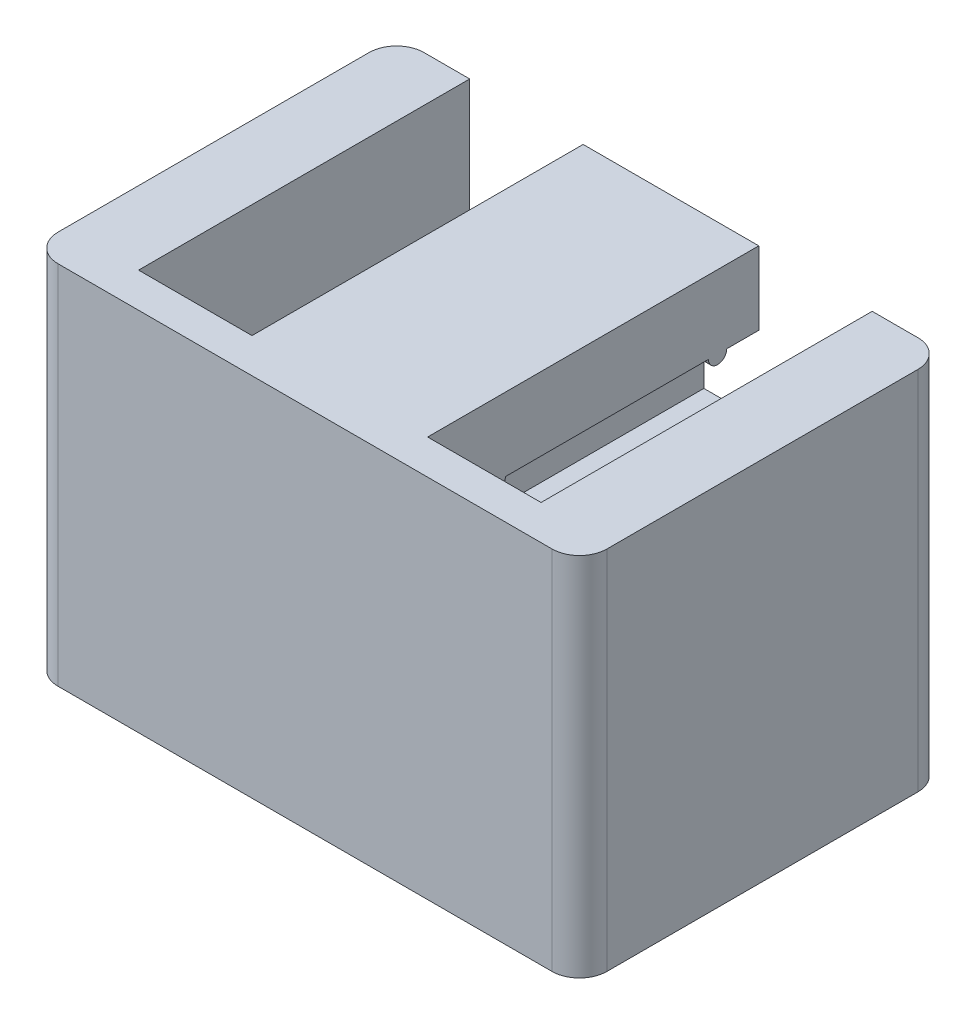
ISO-10303-21;
HEADER;
FILE_DESCRIPTION(('STEP AP214'),'2;1');
FILE_NAME('part.step','',(''),(''),'','','');
FILE_SCHEMA(('AUTOMOTIVE_DESIGN { 1 0 10303 214 1 1 1 1 }'));
ENDSEC;
DATA;
#1=APPLICATION_CONTEXT('core data for automotive mechanical design processes');
#2=APPLICATION_PROTOCOL_DEFINITION('international standard','automotive_design',2000,#1);
#3=PRODUCT_CONTEXT('',#1,'mechanical');
#4=PRODUCT('Part','Part','',(#3));
#5=PRODUCT_RELATED_PRODUCT_CATEGORY('part','',(#4));
#6=PRODUCT_DEFINITION_FORMATION('','',#4);
#7=PRODUCT_DEFINITION_CONTEXT('part definition',#1,'design');
#8=PRODUCT_DEFINITION('design','',#6,#7);
#9=PRODUCT_DEFINITION_SHAPE('','',#8);
#10=(LENGTH_UNIT() NAMED_UNIT(*) SI_UNIT(.MILLI.,.METRE.));
#11=(NAMED_UNIT(*) PLANE_ANGLE_UNIT() SI_UNIT($,.RADIAN.));
#12=(NAMED_UNIT(*) SI_UNIT($,.STERADIAN.) SOLID_ANGLE_UNIT());
#13=UNCERTAINTY_MEASURE_WITH_UNIT(LENGTH_MEASURE(1.E-05),#10,'distance_accuracy_value','');
#14=(GEOMETRIC_REPRESENTATION_CONTEXT(3) GLOBAL_UNCERTAINTY_ASSIGNED_CONTEXT((#13)) GLOBAL_UNIT_ASSIGNED_CONTEXT((#10,
#11,#12)) REPRESENTATION_CONTEXT('',''));
#15=CARTESIAN_POINT('',(0.,0.,0.));
#16=DIRECTION('',(0.,0.,1.));
#17=DIRECTION('',(1.,0.,0.));
#18=AXIS2_PLACEMENT_3D('',#15,#16,#17);
#19=CARTESIAN_POINT('',(1.8,-49.2873456126754,-1.9));
#20=DIRECTION('',(0.,1.,0.));
#21=DIRECTION('',(0.,0.,1.));
#22=AXIS2_PLACEMENT_3D('',#19,#20,#21);
#23=PLANE('',#22);
#24=DIRECTION('',(0.,0.,-1.));
#25=VECTOR('',#24,1.);
#26=CARTESIAN_POINT('',(1.8,-49.2873456126754,-1.9));
#27=LINE('',#26,#25);
#28=CARTESIAN_POINT('',(1.8,-49.2873456126754,-1.9));
#29=VERTEX_POINT('',#28);
#30=CARTESIAN_POINT('',(1.8,-49.2873456126754,-5.14999999999999));
#31=VERTEX_POINT('',#30);
#32=EDGE_CURVE('E247',#29,#31,#27,.T.);
#33=ORIENTED_EDGE('',*,*,#32,.T.);
#34=DIRECTION('',(1.,0.,0.));
#35=VECTOR('',#34,1.);
#36=CARTESIAN_POINT('',(1.8,-49.2873456126754,-5.15));
#37=LINE('',#36,#35);
#38=CARTESIAN_POINT('',(4.8,-49.2873456126754,-5.14999999999999));
#39=VERTEX_POINT('',#38);
#40=EDGE_CURVE('E230',#31,#39,#37,.T.);
#41=ORIENTED_EDGE('',*,*,#40,.T.);
#42=DIRECTION('',(0.,0.,-1.));
#43=VECTOR('',#42,1.);
#44=CARTESIAN_POINT('',(4.8,-49.2873456126754,-1.9));
#45=LINE('',#44,#43);
#46=CARTESIAN_POINT('',(4.8,-49.2873456126754,-1.9));
#47=VERTEX_POINT('',#46);
#48=EDGE_CURVE('E254',#47,#39,#45,.T.);
#49=ORIENTED_EDGE('',*,*,#48,.F.);
#50=DIRECTION('',(1.,0.,0.));
#51=VECTOR('',#50,1.);
#52=CARTESIAN_POINT('',(1.8,-49.2873456126754,-1.9));
#53=LINE('',#52,#51);
#54=EDGE_CURVE('E453',#29,#47,#53,.T.);
#55=ORIENTED_EDGE('',*,*,#54,.F.);
#56=EDGE_LOOP('',(#33,#41,#49,#55));
#57=FACE_BOUND('',#56,.T.);
#58=ADVANCED_FACE('F38',(#57),#23,.F.);
#59=CARTESIAN_POINT('',(4.8,-49.2873456126754,-6.14999999999999));
#60=VERTEX_POINT('',#59);
#61=CARTESIAN_POINT('',(4.8,-49.2873456126754,-17.25));
#62=VERTEX_POINT('',#61);
#63=EDGE_CURVE('E240',#60,#62,#45,.T.);
#64=ORIENTED_EDGE('',*,*,#63,.F.);
#65=DIRECTION('',(1.,0.,0.));
#66=VECTOR('',#65,1.);
#67=CARTESIAN_POINT('',(1.8,-49.2873456126754,-6.15));
#68=LINE('',#67,#66);
#69=CARTESIAN_POINT('',(1.8,-49.2873456126754,-6.15));
#70=VERTEX_POINT('',#69);
#71=EDGE_CURVE('E227',#70,#60,#68,.T.);
#72=ORIENTED_EDGE('',*,*,#71,.F.);
#73=CARTESIAN_POINT('',(1.8,-49.2873456126754,-17.25));
#74=VERTEX_POINT('',#73);
#75=EDGE_CURVE('E238',#70,#74,#27,.T.);
#76=ORIENTED_EDGE('',*,*,#75,.T.);
#77=DIRECTION('',(1.,0.,0.));
#78=VECTOR('',#77,1.);
#79=CARTESIAN_POINT('',(1.8,-49.2873456126754,-17.25));
#80=LINE('',#79,#78);
#81=EDGE_CURVE('E774',#74,#62,#80,.T.);
#82=ORIENTED_EDGE('',*,*,#81,.T.);
#83=EDGE_LOOP('',(#64,#72,#76,#82));
#84=FACE_BOUND('',#83,.T.);
#85=ADVANCED_FACE('F236',(#84),#23,.F.);
#86=CARTESIAN_POINT('',(-1.8,-49.2873456126754,-1.9));
#87=DIRECTION('',(0.,1.,0.));
#88=DIRECTION('',(0.,0.,1.));
#89=AXIS2_PLACEMENT_3D('',#86,#87,#88);
#90=PLANE('',#89);
#91=DIRECTION('',(0.,0.,-1.));
#92=VECTOR('',#91,1.);
#93=CARTESIAN_POINT('',(-1.8,-49.2873456126754,-1.9));
#94=LINE('',#93,#92);
#95=CARTESIAN_POINT('',(-1.8,-49.2873456126754,-6.14999999999999));
#96=VERTEX_POINT('',#95);
#97=CARTESIAN_POINT('',(-1.8,-49.2873456126754,-17.25));
#98=VERTEX_POINT('',#97);
#99=EDGE_CURVE('E314',#96,#98,#94,.T.);
#100=ORIENTED_EDGE('',*,*,#99,.F.);
#101=DIRECTION('',(-1.,0.,0.));
#102=VECTOR('',#101,1.);
#103=CARTESIAN_POINT('',(-1.8,-49.2873456126754,-6.15));
#104=LINE('',#103,#102);
#105=CARTESIAN_POINT('',(-4.8,-49.2873456126754,-6.14999999999999));
#106=VERTEX_POINT('',#105);
#107=EDGE_CURVE('E432',#96,#106,#104,.T.);
#108=ORIENTED_EDGE('',*,*,#107,.T.);
#109=DIRECTION('',(0.,0.,-1.));
#110=VECTOR('',#109,1.);
#111=CARTESIAN_POINT('',(-4.8,-49.2873456126754,-1.9));
#112=LINE('',#111,#110);
#113=CARTESIAN_POINT('',(-4.8,-49.2873456126754,-17.25));
#114=VERTEX_POINT('',#113);
#115=EDGE_CURVE('E300',#106,#114,#112,.T.);
#116=ORIENTED_EDGE('',*,*,#115,.T.);
#117=DIRECTION('',(-1.,0.,0.));
#118=VECTOR('',#117,1.);
#119=CARTESIAN_POINT('',(-1.8,-49.2873456126754,-17.25));
#120=LINE('',#119,#118);
#121=EDGE_CURVE('E286',#98,#114,#120,.T.);
#122=ORIENTED_EDGE('',*,*,#121,.F.);
#123=EDGE_LOOP('',(#100,#108,#116,#122));
#124=FACE_BOUND('',#123,.T.);
#125=ADVANCED_FACE('F430',(#124),#90,.F.);
#126=CARTESIAN_POINT('',(-1.8,-49.2873456126754,-18.25));
#127=VERTEX_POINT('',#126);
#128=CARTESIAN_POINT('',(-1.8,-49.2873456126754,-20.));
#129=VERTEX_POINT('',#128);
#130=EDGE_CURVE('E281',#127,#129,#94,.T.);
#131=ORIENTED_EDGE('',*,*,#130,.F.);
#132=DIRECTION('',(-1.,0.,0.));
#133=VECTOR('',#132,1.);
#134=CARTESIAN_POINT('',(-1.8,-49.2873456126754,-18.25));
#135=LINE('',#134,#133);
#136=CARTESIAN_POINT('',(-4.8,-49.2873456126754,-18.25));
#137=VERTEX_POINT('',#136);
#138=EDGE_CURVE('E424',#127,#137,#135,.T.);
#139=ORIENTED_EDGE('',*,*,#138,.T.);
#140=CARTESIAN_POINT('',(-4.8,-49.2873456126754,-20.));
#141=VERTEX_POINT('',#140);
#142=EDGE_CURVE('E301',#137,#141,#112,.T.);
#143=ORIENTED_EDGE('',*,*,#142,.T.);
#144=DIRECTION('',(1.,0.,0.));
#145=VECTOR('',#144,1.);
#146=CARTESIAN_POINT('',(-1.8,-49.2873456126754,-20.));
#147=LINE('',#146,#145);
#148=EDGE_CURVE('E282',#141,#129,#147,.T.);
#149=ORIENTED_EDGE('',*,*,#148,.T.);
#150=EDGE_LOOP('',(#131,#139,#143,#149));
#151=FACE_BOUND('',#150,.T.);
#152=ADVANCED_FACE('F423',(#151),#90,.F.);
#153=CARTESIAN_POINT('',(-15.,-45.2873456126754,-20.));
#154=DIRECTION('',(-1.,0.,0.));
#155=DIRECTION('',(0.,-1.,0.));
#156=AXIS2_PLACEMENT_3D('',#153,#154,#155);
#157=PLANE('',#156);
#158=DIRECTION('',(0.,0.,1.));
#159=VECTOR('',#158,1.);
#160=CARTESIAN_POINT('',(-15.,-65.2873456126754,-20.));
#161=LINE('',#160,#159);
#162=CARTESIAN_POINT('',(-15.,-65.2873456126754,-18.5));
#163=VERTEX_POINT('',#162);
#164=CARTESIAN_POINT('',(-15.,-65.2873456126754,-1.5));
#165=VERTEX_POINT('',#164);
#166=EDGE_CURVE('E322',#163,#165,#161,.T.);
#167=ORIENTED_EDGE('',*,*,#166,.T.);
#168=DIRECTION('',(0.,-1.,0.));
#169=VECTOR('',#168,1.);
#170=CARTESIAN_POINT('',(-15.,-45.2873456126754,-1.5));
#171=LINE('',#170,#169);
#172=CARTESIAN_POINT('',(-15.,-45.2873456126754,-1.5));
#173=VERTEX_POINT('',#172);
#174=EDGE_CURVE('E12',#165,#173,#171,.F.);
#175=ORIENTED_EDGE('',*,*,#174,.T.);
#176=DIRECTION('',(0.,0.,1.));
#177=VECTOR('',#176,1.);
#178=CARTESIAN_POINT('',(-15.,-45.2873456126754,-20.));
#179=LINE('',#178,#177);
#180=CARTESIAN_POINT('',(-15.,-45.2873456126754,-18.5));
#181=VERTEX_POINT('',#180);
#182=EDGE_CURVE('E330',#181,#173,#179,.T.);
#183=ORIENTED_EDGE('',*,*,#182,.F.);
#184=DIRECTION('',(0.,-1.,0.));
#185=VECTOR('',#184,1.);
#186=CARTESIAN_POINT('',(-15.,-65.2873456126754,-18.5));
#187=LINE('',#186,#185);
#188=EDGE_CURVE('E46',#181,#163,#187,.T.);
#189=ORIENTED_EDGE('',*,*,#188,.T.);
#190=EDGE_LOOP('',(#167,#175,#183,#189));
#191=FACE_BOUND('',#190,.T.);
#192=ADVANCED_FACE('F370',(#191),#157,.T.);
#193=CARTESIAN_POINT('',(-15.,-45.2873456126754,-20.));
#194=DIRECTION('',(0.,1.,0.));
#195=DIRECTION('',(0.,0.,1.));
#196=AXIS2_PLACEMENT_3D('',#193,#194,#195);
#197=PLANE('',#196);
#198=DIRECTION('',(0.,0.,1.));
#199=VECTOR('',#198,1.);
#200=CARTESIAN_POINT('',(15.,-45.2873456126754,-20.));
#201=LINE('',#200,#199);
#202=CARTESIAN_POINT('',(15.,-45.2873456126754,-18.5));
#203=VERTEX_POINT('',#202);
#204=CARTESIAN_POINT('',(15.,-45.2873456126754,-1.5));
#205=VERTEX_POINT('',#204);
#206=EDGE_CURVE('E334',#203,#205,#201,.T.);
#207=ORIENTED_EDGE('',*,*,#206,.F.);
#208=CARTESIAN_POINT('',(13.5,-45.2873456126754,-18.5));
#209=DIRECTION('',(0.,1.,0.));
#210=DIRECTION('',(0.,0.,1.));
#211=AXIS2_PLACEMENT_3D('',#208,#209,#210);
#212=CIRCLE('',#211,1.5);
#213=CARTESIAN_POINT('',(13.5,-45.2873456126754,-20.));
#214=VERTEX_POINT('',#213);
#215=EDGE_CURVE('E351',#203,#214,#212,.T.);
#216=ORIENTED_EDGE('',*,*,#215,.T.);
#217=DIRECTION('',(-1.,0.,0.));
#218=VECTOR('',#217,1.);
#219=CARTESIAN_POINT('',(-15.,-45.2873456126754,-20.));
#220=LINE('',#219,#218);
#221=CARTESIAN_POINT('',(11.,-45.2873456126754,-20.));
#222=VERTEX_POINT('',#221);
#223=EDGE_CURVE('E320',#214,#222,#220,.T.);
#224=ORIENTED_EDGE('',*,*,#223,.T.);
#225=DIRECTION('',(0.,0.,-1.));
#226=VECTOR('',#225,1.);
#227=CARTESIAN_POINT('',(11.,-45.2873456126754,-1.9));
#228=LINE('',#227,#226);
#229=CARTESIAN_POINT('',(11.,-45.2873456126754,-1.9));
#230=VERTEX_POINT('',#229);
#231=EDGE_CURVE('E259',#230,#222,#228,.T.);
#232=ORIENTED_EDGE('',*,*,#231,.F.);
#233=DIRECTION('',(1.,0.,0.));
#234=VECTOR('',#233,1.);
#235=CARTESIAN_POINT('',(4.8,-45.2873456126754,-1.9));
#236=LINE('',#235,#234);
#237=CARTESIAN_POINT('',(4.8,-45.2873456126754,-1.9));
#238=VERTEX_POINT('',#237);
#239=EDGE_CURVE('E441',#238,#230,#236,.T.);
#240=ORIENTED_EDGE('',*,*,#239,.F.);
#241=DIRECTION('',(0.,0.,-1.));
#242=VECTOR('',#241,1.);
#243=CARTESIAN_POINT('',(4.8,-45.2873456126754,-1.9));
#244=LINE('',#243,#242);
#245=CARTESIAN_POINT('',(4.8,-45.2873456126754,-20.));
#246=VERTEX_POINT('',#245);
#247=EDGE_CURVE('E327',#238,#246,#244,.T.);
#248=ORIENTED_EDGE('',*,*,#247,.T.);
#249=CARTESIAN_POINT('',(-4.8,-45.2873456126754,-20.));
#250=VERTEX_POINT('',#249);
#251=EDGE_CURVE('E323',#246,#250,#220,.T.);
#252=ORIENTED_EDGE('',*,*,#251,.T.);
#253=DIRECTION('',(0.,0.,-1.));
#254=VECTOR('',#253,1.);
#255=CARTESIAN_POINT('',(-4.8,-45.2873456126754,-1.9));
#256=LINE('',#255,#254);
#257=CARTESIAN_POINT('',(-4.8,-45.2873456126754,-1.9));
#258=VERTEX_POINT('',#257);
#259=EDGE_CURVE('E302',#258,#250,#256,.T.);
#260=ORIENTED_EDGE('',*,*,#259,.F.);
#261=DIRECTION('',(1.,0.,0.));
#262=VECTOR('',#261,1.);
#263=CARTESIAN_POINT('',(-4.8,-45.2873456126754,-1.9));
#264=LINE('',#263,#262);
#265=CARTESIAN_POINT('',(-11.,-45.2873456126754,-1.9));
#266=VERTEX_POINT('',#265);
#267=EDGE_CURVE('E276',#266,#258,#264,.T.);
#268=ORIENTED_EDGE('',*,*,#267,.F.);
#269=DIRECTION('',(0.,0.,-1.));
#270=VECTOR('',#269,1.);
#271=CARTESIAN_POINT('',(-11.,-45.2873456126754,-1.9));
#272=LINE('',#271,#270);
#273=CARTESIAN_POINT('',(-11.,-45.2873456126754,-20.));
#274=VERTEX_POINT('',#273);
#275=EDGE_CURVE('E304',#266,#274,#272,.T.);
#276=ORIENTED_EDGE('',*,*,#275,.T.);
#277=CARTESIAN_POINT('',(-13.5,-45.2873456126754,-20.));
#278=VERTEX_POINT('',#277);
#279=EDGE_CURVE('E318',#274,#278,#220,.T.);
#280=ORIENTED_EDGE('',*,*,#279,.T.);
#281=CARTESIAN_POINT('',(-13.5,-45.2873456126754,-18.5));
#282=DIRECTION('',(0.,1.,0.));
#283=DIRECTION('',(0.,0.,1.));
#284=AXIS2_PLACEMENT_3D('',#281,#282,#283);
#285=CIRCLE('',#284,1.5);
#286=EDGE_CURVE('E345',#278,#181,#285,.T.);
#287=ORIENTED_EDGE('',*,*,#286,.T.);
#288=ORIENTED_EDGE('',*,*,#182,.T.);
#289=CARTESIAN_POINT('',(-13.5,-45.2873456126754,-1.5));
#290=DIRECTION('',(0.,1.,0.));
#291=DIRECTION('',(0.,0.,1.));
#292=AXIS2_PLACEMENT_3D('',#289,#290,#291);
#293=CIRCLE('',#292,1.5);
#294=CARTESIAN_POINT('',(-13.5,-45.2873456126754,0.));
#295=VERTEX_POINT('',#294);
#296=EDGE_CURVE('E347',#173,#295,#293,.T.);
#297=ORIENTED_EDGE('',*,*,#296,.T.);
#298=DIRECTION('',(-1.,0.,0.));
#299=VECTOR('',#298,1.);
#300=CARTESIAN_POINT('',(-15.,-45.2873456126754,0.));
#301=LINE('',#300,#299);
#302=CARTESIAN_POINT('',(13.5,-45.2873456126754,0.));
#303=VERTEX_POINT('',#302);
#304=EDGE_CURVE('E319',#303,#295,#301,.T.);
#305=ORIENTED_EDGE('',*,*,#304,.F.);
#306=CARTESIAN_POINT('',(13.5,-45.2873456126754,-1.5));
#307=DIRECTION('',(0.,1.,0.));
#308=DIRECTION('',(0.,0.,1.));
#309=AXIS2_PLACEMENT_3D('',#306,#307,#308);
#310=CIRCLE('',#309,1.5);
#311=EDGE_CURVE('E349',#303,#205,#310,.T.);
#312=ORIENTED_EDGE('',*,*,#311,.T.);
#313=EDGE_LOOP('',(#207,#216,#224,#232,#240,#248,#252,#260,#268,#276,#280,#287,#288,#297,#305,#312));
#314=FACE_BOUND('',#313,.T.);
#315=ADVANCED_FACE('F384',(#314),#197,.T.);
#316=CARTESIAN_POINT('',(15.,-45.2873456126754,-20.));
#317=DIRECTION('',(1.,0.,0.));
#318=DIRECTION('',(0.,0.,-1.));
#319=AXIS2_PLACEMENT_3D('',#316,#317,#318);
#320=PLANE('',#319);
#321=DIRECTION('',(0.,0.,1.));
#322=VECTOR('',#321,1.);
#323=CARTESIAN_POINT('',(15.,-65.2873456126754,-20.));
#324=LINE('',#323,#322);
#325=CARTESIAN_POINT('',(15.,-65.2873456126754,-18.5));
#326=VERTEX_POINT('',#325);
#327=CARTESIAN_POINT('',(15.,-65.2873456126754,-1.5));
#328=VERTEX_POINT('',#327);
#329=EDGE_CURVE('E337',#326,#328,#324,.T.);
#330=ORIENTED_EDGE('',*,*,#329,.F.);
#331=DIRECTION('',(0.,1.,0.));
#332=VECTOR('',#331,1.);
#333=CARTESIAN_POINT('',(15.,-45.2873456126754,-18.5));
#334=LINE('',#333,#332);
#335=EDGE_CURVE('E342',#326,#203,#334,.T.);
#336=ORIENTED_EDGE('',*,*,#335,.T.);
#337=ORIENTED_EDGE('',*,*,#206,.T.);
#338=DIRECTION('',(0.,1.,0.));
#339=VECTOR('',#338,1.);
#340=CARTESIAN_POINT('',(15.,-45.2873456126754,-1.5));
#341=LINE('',#340,#339);
#342=EDGE_CURVE('E333',#205,#328,#341,.F.);
#343=ORIENTED_EDGE('',*,*,#342,.T.);
#344=EDGE_LOOP('',(#330,#336,#337,#343));
#345=FACE_BOUND('',#344,.T.);
#346=ADVANCED_FACE('F496',(#345),#320,.T.);
#347=CARTESIAN_POINT('',(-15.,-65.2873456126754,-20.));
#348=DIRECTION('',(0.,-1.,0.));
#349=DIRECTION('',(0.,0.,-1.));
#350=AXIS2_PLACEMENT_3D('',#347,#348,#349);
#351=PLANE('',#350);
#352=DIRECTION('',(1.,0.,0.));
#353=VECTOR('',#352,1.);
#354=CARTESIAN_POINT('',(-15.,-65.2873456126754,-20.));
#355=LINE('',#354,#353);
#356=CARTESIAN_POINT('',(-13.5,-65.2873456126754,-20.));
#357=VERTEX_POINT('',#356);
#358=CARTESIAN_POINT('',(13.5,-65.2873456126754,-20.));
#359=VERTEX_POINT('',#358);
#360=EDGE_CURVE('E315',#357,#359,#355,.T.);
#361=ORIENTED_EDGE('',*,*,#360,.T.);
#362=CARTESIAN_POINT('',(13.5,-65.2873456126754,-18.5));
#363=DIRECTION('',(0.,-1.,0.));
#364=DIRECTION('',(0.,0.,-1.));
#365=AXIS2_PLACEMENT_3D('',#362,#363,#364);
#366=CIRCLE('',#365,1.5);
#367=EDGE_CURVE('E361',#359,#326,#366,.T.);
#368=ORIENTED_EDGE('',*,*,#367,.T.);
#369=ORIENTED_EDGE('',*,*,#329,.T.);
#370=CARTESIAN_POINT('',(13.5,-65.2873456126754,-1.5));
#371=DIRECTION('',(0.,-1.,0.));
#372=DIRECTION('',(0.,0.,-1.));
#373=AXIS2_PLACEMENT_3D('',#370,#371,#372);
#374=CIRCLE('',#373,1.5);
#375=CARTESIAN_POINT('',(13.5,-65.2873456126754,0.));
#376=VERTEX_POINT('',#375);
#377=EDGE_CURVE('E359',#328,#376,#374,.T.);
#378=ORIENTED_EDGE('',*,*,#377,.T.);
#379=DIRECTION('',(1.,0.,0.));
#380=VECTOR('',#379,1.);
#381=CARTESIAN_POINT('',(-15.,-65.2873456126754,0.));
#382=LINE('',#381,#380);
#383=CARTESIAN_POINT('',(-13.5,-65.2873456126754,0.));
#384=VERTEX_POINT('',#383);
#385=EDGE_CURVE('E324',#384,#376,#382,.T.);
#386=ORIENTED_EDGE('',*,*,#385,.F.);
#387=CARTESIAN_POINT('',(-13.5,-65.2873456126754,-1.5));
#388=DIRECTION('',(0.,-1.,0.));
#389=DIRECTION('',(0.,0.,-1.));
#390=AXIS2_PLACEMENT_3D('',#387,#388,#389);
#391=CIRCLE('',#390,1.5);
#392=EDGE_CURVE('E53',#384,#165,#391,.T.);
#393=ORIENTED_EDGE('',*,*,#392,.T.);
#394=ORIENTED_EDGE('',*,*,#166,.F.);
#395=CARTESIAN_POINT('',(-13.5,-65.2873456126754,-18.5));
#396=DIRECTION('',(0.,-1.,0.));
#397=DIRECTION('',(0.,0.,-1.));
#398=AXIS2_PLACEMENT_3D('',#395,#396,#397);
#399=CIRCLE('',#398,1.5);
#400=EDGE_CURVE('E61',#163,#357,#399,.T.);
#401=ORIENTED_EDGE('',*,*,#400,.T.);
#402=EDGE_LOOP('',(#361,#368,#369,#378,#386,#393,#394,#401));
#403=FACE_BOUND('',#402,.T.);
#404=ADVANCED_FACE('F373',(#403),#351,.T.);
#405=CARTESIAN_POINT('',(0.,0.,-20.));
#406=DIRECTION('',(0.,0.,1.));
#407=DIRECTION('',(1.,0.,0.));
#408=AXIS2_PLACEMENT_3D('',#405,#406,#407);
#409=PLANE('',#408);
#410=ORIENTED_EDGE('',*,*,#223,.F.);
#411=DIRECTION('',(0.,1.,0.));
#412=VECTOR('',#411,1.);
#413=CARTESIAN_POINT('',(13.5,-65.2873456126754,-20.));
#414=LINE('',#413,#412);
#415=EDGE_CURVE('E355',#214,#359,#414,.F.);
#416=ORIENTED_EDGE('',*,*,#415,.T.);
#417=ORIENTED_EDGE('',*,*,#360,.F.);
#418=DIRECTION('',(0.,-1.,0.));
#419=VECTOR('',#418,1.);
#420=CARTESIAN_POINT('',(-13.5,-45.2873456126754,-20.));
#421=LINE('',#420,#419);
#422=EDGE_CURVE('E353',#357,#278,#421,.F.);
#423=ORIENTED_EDGE('',*,*,#422,.T.);
#424=ORIENTED_EDGE('',*,*,#279,.F.);
#425=DIRECTION('',(0.,1.,0.));
#426=VECTOR('',#425,1.);
#427=CARTESIAN_POINT('',(-11.,-45.2873456126754,-20.));
#428=LINE('',#427,#426);
#429=CARTESIAN_POINT('',(-11.,-53.5373456126754,-20.));
#430=VERTEX_POINT('',#429);
#431=EDGE_CURVE('E292',#430,#274,#428,.T.);
#432=ORIENTED_EDGE('',*,*,#431,.F.);
#433=DIRECTION('',(-1.,0.,0.));
#434=VECTOR('',#433,1.);
#435=CARTESIAN_POINT('',(-11.,-53.5373456126754,-20.));
#436=LINE('',#435,#434);
#437=CARTESIAN_POINT('',(-1.8,-53.5373456126754,-20.));
#438=VERTEX_POINT('',#437);
#439=EDGE_CURVE('E289',#438,#430,#436,.T.);
#440=ORIENTED_EDGE('',*,*,#439,.F.);
#441=DIRECTION('',(0.,-1.,0.));
#442=VECTOR('',#441,1.);
#443=CARTESIAN_POINT('',(-1.8,-53.5373456126754,-20.));
#444=LINE('',#443,#442);
#445=EDGE_CURVE('E285',#129,#438,#444,.T.);
#446=ORIENTED_EDGE('',*,*,#445,.F.);
#447=ORIENTED_EDGE('',*,*,#148,.F.);
#448=DIRECTION('',(0.,-1.,0.));
#449=VECTOR('',#448,1.);
#450=CARTESIAN_POINT('',(-4.8,-49.2873456126754,-20.));
#451=LINE('',#450,#449);
#452=EDGE_CURVE('E267',#250,#141,#451,.T.);
#453=ORIENTED_EDGE('',*,*,#452,.F.);
#454=ORIENTED_EDGE('',*,*,#251,.F.);
#455=DIRECTION('',(0.,1.,0.));
#456=VECTOR('',#455,1.);
#457=CARTESIAN_POINT('',(4.8,-49.2873456126754,-20.));
#458=LINE('',#457,#456);
#459=CARTESIAN_POINT('',(4.8,-49.2873456126754,-20.));
#460=VERTEX_POINT('',#459);
#461=EDGE_CURVE('E396',#460,#246,#458,.T.);
#462=ORIENTED_EDGE('',*,*,#461,.F.);
#463=DIRECTION('',(1.,0.,0.));
#464=VECTOR('',#463,1.);
#465=CARTESIAN_POINT('',(1.8,-49.2873456126754,-20.));
#466=LINE('',#465,#464);
#467=CARTESIAN_POINT('',(1.8,-49.2873456126754,-20.));
#468=VERTEX_POINT('',#467);
#469=EDGE_CURVE('E466',#468,#460,#466,.T.);
#470=ORIENTED_EDGE('',*,*,#469,.F.);
#471=DIRECTION('',(0.,1.,0.));
#472=VECTOR('',#471,1.);
#473=CARTESIAN_POINT('',(1.8,-53.5373456126754,-20.));
#474=LINE('',#473,#472);
#475=CARTESIAN_POINT('',(1.8,-53.5373456126754,-20.));
#476=VERTEX_POINT('',#475);
#477=EDGE_CURVE('E463',#476,#468,#474,.T.);
#478=ORIENTED_EDGE('',*,*,#477,.F.);
#479=DIRECTION('',(-1.,0.,0.));
#480=VECTOR('',#479,1.);
#481=CARTESIAN_POINT('',(11.,-53.5373456126754,-20.));
#482=LINE('',#481,#480);
#483=CARTESIAN_POINT('',(11.,-53.5373456126754,-20.));
#484=VERTEX_POINT('',#483);
#485=EDGE_CURVE('E460',#484,#476,#482,.T.);
#486=ORIENTED_EDGE('',*,*,#485,.F.);
#487=DIRECTION('',(0.,-1.,0.));
#488=VECTOR('',#487,1.);
#489=CARTESIAN_POINT('',(11.,-45.2873456126754,-20.));
#490=LINE('',#489,#488);
#491=EDGE_CURVE('E299',#222,#484,#490,.T.);
#492=ORIENTED_EDGE('',*,*,#491,.F.);
#493=EDGE_LOOP('',(#410,#416,#417,#423,#424,#432,#440,#446,#447,#453,#454,#462,#470,#478,#486,#492));
#494=FACE_BOUND('',#493,.T.);
#495=ADVANCED_FACE('F378',(#494),#409,.F.);
#496=CARTESIAN_POINT('',(0.,0.,0.));
#497=DIRECTION('',(0.,0.,1.));
#498=DIRECTION('',(1.,0.,0.));
#499=AXIS2_PLACEMENT_3D('',#496,#497,#498);
#500=PLANE('',#499);
#501=ORIENTED_EDGE('',*,*,#385,.T.);
#502=DIRECTION('',(0.,1.,0.));
#503=VECTOR('',#502,1.);
#504=CARTESIAN_POINT('',(13.5,0.,0.));
#505=LINE('',#504,#503);
#506=EDGE_CURVE('E366',#376,#303,#505,.T.);
#507=ORIENTED_EDGE('',*,*,#506,.T.);
#508=ORIENTED_EDGE('',*,*,#304,.T.);
#509=DIRECTION('',(0.,-1.,0.));
#510=VECTOR('',#509,1.);
#511=CARTESIAN_POINT('',(-13.5,0.,0.));
#512=LINE('',#511,#510);
#513=EDGE_CURVE('E363',#295,#384,#512,.T.);
#514=ORIENTED_EDGE('',*,*,#513,.T.);
#515=EDGE_LOOP('',(#501,#507,#508,#514));
#516=FACE_BOUND('',#515,.T.);
#517=ADVANCED_FACE('F502',(#516),#500,.T.);
#518=CARTESIAN_POINT('',(-4.8,-49.2873456126754,-1.9));
#519=VERTEX_POINT('',#518);
#520=CARTESIAN_POINT('',(-4.8,-49.2873456126754,-5.14999999999999));
#521=VERTEX_POINT('',#520);
#522=EDGE_CURVE('E296',#519,#521,#112,.T.);
#523=ORIENTED_EDGE('',*,*,#522,.T.);
#524=DIRECTION('',(-1.,0.,0.));
#525=VECTOR('',#524,1.);
#526=CARTESIAN_POINT('',(-1.8,-49.2873456126754,-5.15));
#527=LINE('',#526,#525);
#528=CARTESIAN_POINT('',(-1.8,-49.2873456126754,-5.15));
#529=VERTEX_POINT('',#528);
#530=EDGE_CURVE('E764',#529,#521,#527,.T.);
#531=ORIENTED_EDGE('',*,*,#530,.F.);
#532=CARTESIAN_POINT('',(-1.8,-49.2873456126754,-1.9));
#533=VERTEX_POINT('',#532);
#534=EDGE_CURVE('E311',#533,#529,#94,.T.);
#535=ORIENTED_EDGE('',*,*,#534,.F.);
#536=DIRECTION('',(1.,0.,0.));
#537=VECTOR('',#536,1.);
#538=CARTESIAN_POINT('',(-1.8,-49.2873456126754,-1.9));
#539=LINE('',#538,#537);
#540=EDGE_CURVE('E263',#519,#533,#539,.T.);
#541=ORIENTED_EDGE('',*,*,#540,.F.);
#542=EDGE_LOOP('',(#523,#531,#535,#541));
#543=FACE_BOUND('',#542,.T.);
#544=ADVANCED_FACE('F563',(#543),#90,.F.);
#545=CARTESIAN_POINT('',(-4.8,-49.2873456126754,-1.9));
#546=DIRECTION('',(1.,0.,0.));
#547=DIRECTION('',(0.,0.,-1.));
#548=AXIS2_PLACEMENT_3D('',#545,#546,#547);
#549=PLANE('',#548);
#550=ORIENTED_EDGE('',*,*,#452,.T.);
#551=ORIENTED_EDGE('',*,*,#142,.F.);
#552=CARTESIAN_POINT('',(-4.8,-49.2873456126754,-17.75));
#553=DIRECTION('',(-1.,0.,0.));
#554=DIRECTION('',(0.,0.,1.));
#555=AXIS2_PLACEMENT_3D('',#552,#553,#554);
#556=CIRCLE('',#555,0.5);
#557=EDGE_CURVE('E433',#137,#114,#556,.T.);
#558=ORIENTED_EDGE('',*,*,#557,.T.);
#559=ORIENTED_EDGE('',*,*,#115,.F.);
#560=CARTESIAN_POINT('',(-4.8,-49.2873456126754,-5.64999999999999));
#561=DIRECTION('',(-1.,0.,0.));
#562=DIRECTION('',(0.,0.,1.));
#563=AXIS2_PLACEMENT_3D('',#560,#561,#562);
#564=CIRCLE('',#563,0.5);
#565=EDGE_CURVE('E769',#106,#521,#564,.T.);
#566=ORIENTED_EDGE('',*,*,#565,.T.);
#567=ORIENTED_EDGE('',*,*,#522,.F.);
#568=DIRECTION('',(0.,-1.,0.));
#569=VECTOR('',#568,1.);
#570=CARTESIAN_POINT('',(-4.8,-49.2873456126754,-1.9));
#571=LINE('',#570,#569);
#572=EDGE_CURVE('E278',#258,#519,#571,.T.);
#573=ORIENTED_EDGE('',*,*,#572,.F.);
#574=ORIENTED_EDGE('',*,*,#259,.T.);
#575=EDGE_LOOP('',(#550,#551,#558,#559,#566,#567,#573,#574));
#576=FACE_BOUND('',#575,.T.);
#577=ADVANCED_FACE('F401',(#576),#549,.F.);
#578=CARTESIAN_POINT('',(-11.,-45.2873456126754,-1.9));
#579=DIRECTION('',(-1.,0.,0.));
#580=DIRECTION('',(0.,-1.,0.));
#581=AXIS2_PLACEMENT_3D('',#578,#579,#580);
#582=PLANE('',#581);
#583=ORIENTED_EDGE('',*,*,#431,.T.);
#584=ORIENTED_EDGE('',*,*,#275,.F.);
#585=DIRECTION('',(0.,1.,0.));
#586=VECTOR('',#585,1.);
#587=CARTESIAN_POINT('',(-11.,-45.2873456126754,-1.9));
#588=LINE('',#587,#586);
#589=CARTESIAN_POINT('',(-11.,-53.5373456126754,-1.9));
#590=VERTEX_POINT('',#589);
#591=EDGE_CURVE('E273',#590,#266,#588,.T.);
#592=ORIENTED_EDGE('',*,*,#591,.F.);
#593=DIRECTION('',(0.,0.,-1.));
#594=VECTOR('',#593,1.);
#595=CARTESIAN_POINT('',(-11.,-53.5373456126754,-1.9));
#596=LINE('',#595,#594);
#597=EDGE_CURVE('E307',#590,#430,#596,.T.);
#598=ORIENTED_EDGE('',*,*,#597,.T.);
#599=EDGE_LOOP('',(#583,#584,#592,#598));
#600=FACE_BOUND('',#599,.T.);
#601=ADVANCED_FACE('F410',(#600),#582,.F.);
#602=CARTESIAN_POINT('',(-11.,-53.5373456126754,-1.9));
#603=DIRECTION('',(0.,-1.,0.));
#604=DIRECTION('',(0.,0.,-1.));
#605=AXIS2_PLACEMENT_3D('',#602,#603,#604);
#606=PLANE('',#605);
#607=ORIENTED_EDGE('',*,*,#439,.T.);
#608=ORIENTED_EDGE('',*,*,#597,.F.);
#609=DIRECTION('',(-1.,0.,0.));
#610=VECTOR('',#609,1.);
#611=CARTESIAN_POINT('',(-11.,-53.5373456126754,-1.9));
#612=LINE('',#611,#610);
#613=CARTESIAN_POINT('',(-1.8,-53.5373456126754,-1.9));
#614=VERTEX_POINT('',#613);
#615=EDGE_CURVE('E270',#614,#590,#612,.T.);
#616=ORIENTED_EDGE('',*,*,#615,.F.);
#617=DIRECTION('',(0.,0.,-1.));
#618=VECTOR('',#617,1.);
#619=CARTESIAN_POINT('',(-1.8,-53.5373456126754,-1.9));
#620=LINE('',#619,#618);
#621=EDGE_CURVE('E309',#614,#438,#620,.T.);
#622=ORIENTED_EDGE('',*,*,#621,.T.);
#623=EDGE_LOOP('',(#607,#608,#616,#622));
#624=FACE_BOUND('',#623,.T.);
#625=ADVANCED_FACE('F413',(#624),#606,.F.);
#626=CARTESIAN_POINT('',(-1.8,-53.5373456126754,-1.9));
#627=DIRECTION('',(1.,0.,0.));
#628=DIRECTION('',(0.,0.,-1.));
#629=AXIS2_PLACEMENT_3D('',#626,#627,#628);
#630=PLANE('',#629);
#631=ORIENTED_EDGE('',*,*,#534,.T.);
#632=CARTESIAN_POINT('',(-1.8,-49.2873456126754,-5.65));
#633=DIRECTION('',(-1.,0.,0.));
#634=DIRECTION('',(0.,0.,1.));
#635=AXIS2_PLACEMENT_3D('',#632,#633,#634);
#636=CIRCLE('',#635,0.5);
#637=EDGE_CURVE('E766',#96,#529,#636,.T.);
#638=ORIENTED_EDGE('',*,*,#637,.F.);
#639=ORIENTED_EDGE('',*,*,#99,.T.);
#640=CARTESIAN_POINT('',(-1.8,-49.2873456126754,-17.75));
#641=DIRECTION('',(-1.,0.,0.));
#642=DIRECTION('',(0.,0.,1.));
#643=AXIS2_PLACEMENT_3D('',#640,#641,#642);
#644=CIRCLE('',#643,0.5);
#645=EDGE_CURVE('E420',#127,#98,#644,.T.);
#646=ORIENTED_EDGE('',*,*,#645,.F.);
#647=ORIENTED_EDGE('',*,*,#130,.T.);
#648=ORIENTED_EDGE('',*,*,#445,.T.);
#649=ORIENTED_EDGE('',*,*,#621,.F.);
#650=DIRECTION('',(0.,-1.,0.));
#651=VECTOR('',#650,1.);
#652=CARTESIAN_POINT('',(-1.8,-53.5373456126754,-1.9));
#653=LINE('',#652,#651);
#654=EDGE_CURVE('E266',#533,#614,#653,.T.);
#655=ORIENTED_EDGE('',*,*,#654,.F.);
#656=EDGE_LOOP('',(#631,#638,#639,#646,#647,#648,#649,#655));
#657=FACE_BOUND('',#656,.T.);
#658=ADVANCED_FACE('F416',(#657),#630,.F.);
#659=CARTESIAN_POINT('',(0.,0.,-1.9));
#660=DIRECTION('',(0.,0.,-1.));
#661=DIRECTION('',(-1.,0.,0.));
#662=AXIS2_PLACEMENT_3D('',#659,#660,#661);
#663=PLANE('',#662);
#664=ORIENTED_EDGE('',*,*,#540,.T.);
#665=ORIENTED_EDGE('',*,*,#654,.T.);
#666=ORIENTED_EDGE('',*,*,#615,.T.);
#667=ORIENTED_EDGE('',*,*,#591,.T.);
#668=ORIENTED_EDGE('',*,*,#267,.T.);
#669=ORIENTED_EDGE('',*,*,#572,.T.);
#670=EDGE_LOOP('',(#664,#665,#666,#667,#668,#669));
#671=FACE_BOUND('',#670,.T.);
#672=ADVANCED_FACE('F406',(#671),#663,.T.);
#673=CARTESIAN_POINT('',(4.8,-49.2873456126754,-1.9));
#674=DIRECTION('',(-1.,0.,0.));
#675=DIRECTION('',(0.,0.,1.));
#676=AXIS2_PLACEMENT_3D('',#673,#674,#675);
#677=PLANE('',#676);
#678=ORIENTED_EDGE('',*,*,#461,.T.);
#679=ORIENTED_EDGE('',*,*,#247,.F.);
#680=DIRECTION('',(0.,1.,0.));
#681=VECTOR('',#680,1.);
#682=CARTESIAN_POINT('',(4.8,-49.2873456126754,-1.9));
#683=LINE('',#682,#681);
#684=EDGE_CURVE('E262',#47,#238,#683,.T.);
#685=ORIENTED_EDGE('',*,*,#684,.F.);
#686=ORIENTED_EDGE('',*,*,#48,.T.);
#687=CARTESIAN_POINT('',(4.8,-49.2873456126754,-5.64999999999999));
#688=DIRECTION('',(-1.,0.,0.));
#689=DIRECTION('',(0.,0.,1.));
#690=AXIS2_PLACEMENT_3D('',#687,#688,#689);
#691=CIRCLE('',#690,0.5);
#692=EDGE_CURVE('E242',#39,#60,#691,.F.);
#693=ORIENTED_EDGE('',*,*,#692,.T.);
#694=ORIENTED_EDGE('',*,*,#63,.T.);
#695=CARTESIAN_POINT('',(4.8,-49.2873456126754,-17.75));
#696=DIRECTION('',(-1.,0.,0.));
#697=DIRECTION('',(0.,0.,1.));
#698=AXIS2_PLACEMENT_3D('',#695,#696,#697);
#699=CIRCLE('',#698,0.5);
#700=CARTESIAN_POINT('',(4.8,-49.2873456126754,-18.25));
#701=VERTEX_POINT('',#700);
#702=EDGE_CURVE('E475',#62,#701,#699,.F.);
#703=ORIENTED_EDGE('',*,*,#702,.T.);
#704=EDGE_CURVE('E250',#701,#460,#45,.T.);
#705=ORIENTED_EDGE('',*,*,#704,.T.);
#706=EDGE_LOOP('',(#678,#679,#685,#686,#693,#694,#703,#705));
#707=FACE_BOUND('',#706,.T.);
#708=ADVANCED_FACE('F473',(#707),#677,.F.);
#709=ORIENTED_EDGE('',*,*,#704,.F.);
#710=DIRECTION('',(1.,0.,0.));
#711=VECTOR('',#710,1.);
#712=CARTESIAN_POINT('',(1.8,-49.2873456126754,-18.25));
#713=LINE('',#712,#711);
#714=CARTESIAN_POINT('',(1.8,-49.2873456126754,-18.25));
#715=VERTEX_POINT('',#714);
#716=EDGE_CURVE('E767',#715,#701,#713,.T.);
#717=ORIENTED_EDGE('',*,*,#716,.F.);
#718=EDGE_CURVE('E248',#715,#468,#27,.T.);
#719=ORIENTED_EDGE('',*,*,#718,.T.);
#720=ORIENTED_EDGE('',*,*,#469,.T.);
#721=EDGE_LOOP('',(#709,#717,#719,#720));
#722=FACE_BOUND('',#721,.T.);
#723=ADVANCED_FACE('F479',(#722),#23,.F.);
#724=CARTESIAN_POINT('',(1.8,-53.5373456126754,-1.9));
#725=DIRECTION('',(-1.,0.,0.));
#726=DIRECTION('',(0.,0.,1.));
#727=AXIS2_PLACEMENT_3D('',#724,#725,#726);
#728=PLANE('',#727);
#729=ORIENTED_EDGE('',*,*,#75,.F.);
#730=CARTESIAN_POINT('',(1.8,-49.2873456126754,-5.65));
#731=DIRECTION('',(-1.,0.,0.));
#732=DIRECTION('',(0.,0.,1.));
#733=AXIS2_PLACEMENT_3D('',#730,#731,#732);
#734=CIRCLE('',#733,0.5);
#735=EDGE_CURVE('E224',#31,#70,#734,.F.);
#736=ORIENTED_EDGE('',*,*,#735,.F.);
#737=ORIENTED_EDGE('',*,*,#32,.F.);
#738=DIRECTION('',(0.,1.,0.));
#739=VECTOR('',#738,1.);
#740=CARTESIAN_POINT('',(1.8,-53.5373456126754,-1.9));
#741=LINE('',#740,#739);
#742=CARTESIAN_POINT('',(1.8,-53.5373456126754,-1.9));
#743=VERTEX_POINT('',#742);
#744=EDGE_CURVE('E450',#743,#29,#741,.T.);
#745=ORIENTED_EDGE('',*,*,#744,.F.);
#746=DIRECTION('',(0.,0.,-1.));
#747=VECTOR('',#746,1.);
#748=CARTESIAN_POINT('',(1.8,-53.5373456126754,-1.9));
#749=LINE('',#748,#747);
#750=EDGE_CURVE('E251',#743,#476,#749,.T.);
#751=ORIENTED_EDGE('',*,*,#750,.T.);
#752=ORIENTED_EDGE('',*,*,#477,.T.);
#753=ORIENTED_EDGE('',*,*,#718,.F.);
#754=CARTESIAN_POINT('',(1.8,-49.2873456126754,-17.75));
#755=DIRECTION('',(-1.,0.,0.));
#756=DIRECTION('',(0.,0.,1.));
#757=AXIS2_PLACEMENT_3D('',#754,#755,#756);
#758=CIRCLE('',#757,0.5);
#759=EDGE_CURVE('E241',#74,#715,#758,.F.);
#760=ORIENTED_EDGE('',*,*,#759,.F.);
#761=EDGE_LOOP('',(#729,#736,#737,#745,#751,#752,#753,#760));
#762=FACE_BOUND('',#761,.T.);
#763=ADVANCED_FACE('F245',(#762),#728,.F.);
#764=CARTESIAN_POINT('',(11.,-53.5373456126754,-1.9));
#765=DIRECTION('',(0.,-1.,0.));
#766=DIRECTION('',(0.,0.,-1.));
#767=AXIS2_PLACEMENT_3D('',#764,#765,#766);
#768=PLANE('',#767);
#769=ORIENTED_EDGE('',*,*,#485,.T.);
#770=ORIENTED_EDGE('',*,*,#750,.F.);
#771=DIRECTION('',(-1.,0.,0.));
#772=VECTOR('',#771,1.);
#773=CARTESIAN_POINT('',(11.,-53.5373456126754,-1.9));
#774=LINE('',#773,#772);
#775=CARTESIAN_POINT('',(11.,-53.5373456126754,-1.9));
#776=VERTEX_POINT('',#775);
#777=EDGE_CURVE('E447',#776,#743,#774,.T.);
#778=ORIENTED_EDGE('',*,*,#777,.F.);
#779=DIRECTION('',(0.,0.,-1.));
#780=VECTOR('',#779,1.);
#781=CARTESIAN_POINT('',(11.,-53.5373456126754,-1.9));
#782=LINE('',#781,#780);
#783=EDGE_CURVE('E257',#776,#484,#782,.T.);
#784=ORIENTED_EDGE('',*,*,#783,.T.);
#785=EDGE_LOOP('',(#769,#770,#778,#784));
#786=FACE_BOUND('',#785,.T.);
#787=ADVANCED_FACE('F486',(#786),#768,.F.);
#788=CARTESIAN_POINT('',(11.,-45.2873456126754,-1.9));
#789=DIRECTION('',(1.,0.,0.));
#790=DIRECTION('',(0.,1.,0.));
#791=AXIS2_PLACEMENT_3D('',#788,#789,#790);
#792=PLANE('',#791);
#793=ORIENTED_EDGE('',*,*,#491,.T.);
#794=ORIENTED_EDGE('',*,*,#783,.F.);
#795=DIRECTION('',(0.,-1.,0.));
#796=VECTOR('',#795,1.);
#797=CARTESIAN_POINT('',(11.,-45.2873456126754,-1.9));
#798=LINE('',#797,#796);
#799=EDGE_CURVE('E444',#230,#776,#798,.T.);
#800=ORIENTED_EDGE('',*,*,#799,.F.);
#801=ORIENTED_EDGE('',*,*,#231,.T.);
#802=EDGE_LOOP('',(#793,#794,#800,#801));
#803=FACE_BOUND('',#802,.T.);
#804=ADVANCED_FACE('F488',(#803),#792,.F.);
#805=CARTESIAN_POINT('',(0.,0.,-1.9));
#806=DIRECTION('',(0.,0.,-1.));
#807=DIRECTION('',(-1.,0.,0.));
#808=AXIS2_PLACEMENT_3D('',#805,#806,#807);
#809=PLANE('',#808);
#810=ORIENTED_EDGE('',*,*,#239,.T.);
#811=ORIENTED_EDGE('',*,*,#799,.T.);
#812=ORIENTED_EDGE('',*,*,#777,.T.);
#813=ORIENTED_EDGE('',*,*,#744,.T.);
#814=ORIENTED_EDGE('',*,*,#54,.T.);
#815=ORIENTED_EDGE('',*,*,#684,.T.);
#816=EDGE_LOOP('',(#810,#811,#812,#813,#814,#815));
#817=FACE_BOUND('',#816,.T.);
#818=ADVANCED_FACE('F531',(#817),#809,.T.);
#819=CARTESIAN_POINT('',(-1.8,-49.2873456126754,-17.75));
#820=DIRECTION('',(-1.,0.,0.));
#821=DIRECTION('',(0.,0.,1.));
#822=AXIS2_PLACEMENT_3D('',#819,#820,#821);
#823=CYLINDRICAL_SURFACE('',#822,0.5);
#824=ORIENTED_EDGE('',*,*,#121,.T.);
#825=ORIENTED_EDGE('',*,*,#557,.F.);
#826=ORIENTED_EDGE('',*,*,#138,.F.);
#827=ORIENTED_EDGE('',*,*,#645,.T.);
#828=EDGE_LOOP('',(#824,#825,#826,#827));
#829=FACE_BOUND('',#828,.T.);
#830=ADVANCED_FACE('F436',(#829),#823,.T.);
#831=CARTESIAN_POINT('',(-1.8,-49.2873456126754,-5.65));
#832=DIRECTION('',(-1.,0.,0.));
#833=DIRECTION('',(0.,0.,1.));
#834=AXIS2_PLACEMENT_3D('',#831,#832,#833);
#835=CYLINDRICAL_SURFACE('',#834,0.5);
#836=ORIENTED_EDGE('',*,*,#530,.T.);
#837=ORIENTED_EDGE('',*,*,#565,.F.);
#838=ORIENTED_EDGE('',*,*,#107,.F.);
#839=ORIENTED_EDGE('',*,*,#637,.T.);
#840=EDGE_LOOP('',(#836,#837,#838,#839));
#841=FACE_BOUND('',#840,.T.);
#842=ADVANCED_FACE('F537',(#841),#835,.T.);
#843=CARTESIAN_POINT('',(1.8,-49.2873456126754,-17.75));
#844=DIRECTION('',(1.,0.,0.));
#845=DIRECTION('',(0.,0.,-1.));
#846=AXIS2_PLACEMENT_3D('',#843,#844,#845);
#847=CYLINDRICAL_SURFACE('',#846,0.5);
#848=ORIENTED_EDGE('',*,*,#716,.T.);
#849=ORIENTED_EDGE('',*,*,#702,.F.);
#850=ORIENTED_EDGE('',*,*,#81,.F.);
#851=ORIENTED_EDGE('',*,*,#759,.T.);
#852=EDGE_LOOP('',(#848,#849,#850,#851));
#853=FACE_BOUND('',#852,.T.);
#854=ADVANCED_FACE('F540',(#853),#847,.T.);
#855=CARTESIAN_POINT('',(1.8,-49.2873456126754,-5.65));
#856=DIRECTION('',(1.,0.,0.));
#857=DIRECTION('',(0.,0.,-1.));
#858=AXIS2_PLACEMENT_3D('',#855,#856,#857);
#859=CYLINDRICAL_SURFACE('',#858,0.5);
#860=ORIENTED_EDGE('',*,*,#71,.T.);
#861=ORIENTED_EDGE('',*,*,#692,.F.);
#862=ORIENTED_EDGE('',*,*,#40,.F.);
#863=ORIENTED_EDGE('',*,*,#735,.T.);
#864=EDGE_LOOP('',(#860,#861,#862,#863));
#865=FACE_BOUND('',#864,.T.);
#866=ADVANCED_FACE('F226',(#865),#859,.T.);
#867=CARTESIAN_POINT('',(13.5,-45.2873456126754,-18.5));
#868=DIRECTION('',(0.,-1.,0.));
#869=DIRECTION('',(0.,0.,-1.));
#870=AXIS2_PLACEMENT_3D('',#867,#868,#869);
#871=CYLINDRICAL_SURFACE('',#870,1.5);
#872=ORIENTED_EDGE('',*,*,#367,.F.);
#873=ORIENTED_EDGE('',*,*,#415,.F.);
#874=ORIENTED_EDGE('',*,*,#215,.F.);
#875=ORIENTED_EDGE('',*,*,#335,.F.);
#876=EDGE_LOOP('',(#872,#873,#874,#875));
#877=FACE_BOUND('',#876,.T.);
#878=ADVANCED_FACE('F491',(#877),#871,.T.);
#879=CARTESIAN_POINT('',(13.5,0.,-1.5));
#880=DIRECTION('',(0.,1.,0.));
#881=DIRECTION('',(0.,0.,1.));
#882=AXIS2_PLACEMENT_3D('',#879,#880,#881);
#883=CYLINDRICAL_SURFACE('',#882,1.5);
#884=ORIENTED_EDGE('',*,*,#377,.F.);
#885=ORIENTED_EDGE('',*,*,#342,.F.);
#886=ORIENTED_EDGE('',*,*,#311,.F.);
#887=ORIENTED_EDGE('',*,*,#506,.F.);
#888=EDGE_LOOP('',(#884,#885,#886,#887));
#889=FACE_BOUND('',#888,.T.);
#890=ADVANCED_FACE('F499',(#889),#883,.T.);
#891=CARTESIAN_POINT('',(-13.5,0.,-1.5));
#892=DIRECTION('',(0.,-1.,0.));
#893=DIRECTION('',(1.,0.,0.));
#894=AXIS2_PLACEMENT_3D('',#891,#892,#893);
#895=CYLINDRICAL_SURFACE('',#894,1.5);
#896=ORIENTED_EDGE('',*,*,#296,.F.);
#897=ORIENTED_EDGE('',*,*,#174,.F.);
#898=ORIENTED_EDGE('',*,*,#392,.F.);
#899=ORIENTED_EDGE('',*,*,#513,.F.);
#900=EDGE_LOOP('',(#896,#897,#898,#899));
#901=FACE_BOUND('',#900,.T.);
#902=ADVANCED_FACE('F506',(#901),#895,.T.);
#903=CARTESIAN_POINT('',(-13.5,-45.2873456126754,-18.5));
#904=DIRECTION('',(0.,1.,0.));
#905=DIRECTION('',(-1.,0.,0.));
#906=AXIS2_PLACEMENT_3D('',#903,#904,#905);
#907=CYLINDRICAL_SURFACE('',#906,1.5);
#908=ORIENTED_EDGE('',*,*,#286,.F.);
#909=ORIENTED_EDGE('',*,*,#422,.F.);
#910=ORIENTED_EDGE('',*,*,#400,.F.);
#911=ORIENTED_EDGE('',*,*,#188,.F.);
#912=EDGE_LOOP('',(#908,#909,#910,#911));
#913=FACE_BOUND('',#912,.T.);
#914=ADVANCED_FACE('F40',(#913),#907,.T.);
#915=CLOSED_SHELL('',(#58,#85,#125,#152,#192,#315,#346,#404,#495,#517,#544,#577,#601,#625,#658,
#672,#708,#723,#763,#787,#804,#818,#830,#842,#854,#866,#878,#890,#902,#914));
#916=MANIFOLD_SOLID_BREP('B2',#915);
#917=ADVANCED_BREP_SHAPE_REPRESENTATION('',(#18,#916),#14);
#918=SHAPE_DEFINITION_REPRESENTATION(#9,#917);
ENDSEC;
END-ISO-10303-21;
